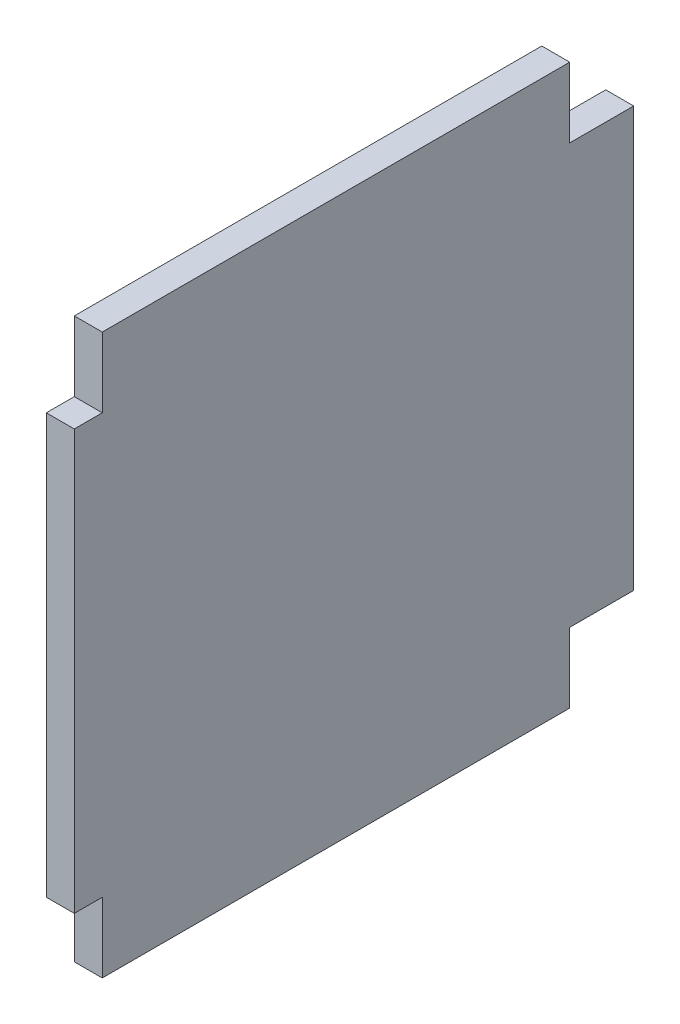
ISO-10303-21;
HEADER;
FILE_DESCRIPTION(('STEP AP214'),'2;1');
FILE_NAME('part.step','',(''),(''),'','','');
FILE_SCHEMA(('AUTOMOTIVE_DESIGN { 1 0 10303 214 1 1 1 1 }'));
ENDSEC;
DATA;
#1=APPLICATION_CONTEXT('core data for automotive mechanical design processes');
#2=APPLICATION_PROTOCOL_DEFINITION('international standard','automotive_design',2000,#1);
#3=PRODUCT_CONTEXT('',#1,'mechanical');
#4=PRODUCT('Part','Part','',(#3));
#5=PRODUCT_RELATED_PRODUCT_CATEGORY('part','',(#4));
#6=PRODUCT_DEFINITION_FORMATION('','',#4);
#7=PRODUCT_DEFINITION_CONTEXT('part definition',#1,'design');
#8=PRODUCT_DEFINITION('design','',#6,#7);
#9=PRODUCT_DEFINITION_SHAPE('','',#8);
#10=(LENGTH_UNIT() NAMED_UNIT(*) SI_UNIT(.MILLI.,.METRE.));
#11=(NAMED_UNIT(*) PLANE_ANGLE_UNIT() SI_UNIT($,.RADIAN.));
#12=(NAMED_UNIT(*) SI_UNIT($,.STERADIAN.) SOLID_ANGLE_UNIT());
#13=UNCERTAINTY_MEASURE_WITH_UNIT(LENGTH_MEASURE(1.E-05),#10,'distance_accuracy_value','');
#14=(GEOMETRIC_REPRESENTATION_CONTEXT(3) GLOBAL_UNCERTAINTY_ASSIGNED_CONTEXT((#13)) GLOBAL_UNIT_ASSIGNED_CONTEXT((#10,
#11,#12)) REPRESENTATION_CONTEXT('',''));
#15=CARTESIAN_POINT('',(0.,0.,0.));
#16=DIRECTION('',(0.,0.,1.));
#17=DIRECTION('',(1.,0.,0.));
#18=AXIS2_PLACEMENT_3D('',#15,#16,#17);
#19=CARTESIAN_POINT('',(214.,15.,65.4944730967406));
#20=DIRECTION('',(0.,-1.,0.));
#21=DIRECTION('',(0.,0.,-1.));
#22=AXIS2_PLACEMENT_3D('',#19,#20,#21);
#23=PLANE('',#22);
#24=DIRECTION('',(0.,0.,-1.));
#25=VECTOR('',#24,1.);
#26=CARTESIAN_POINT('',(216.,15.,65.4944730967406));
#27=LINE('',#26,#25);
#28=CARTESIAN_POINT('',(216.,15.,35.4278803399948));
#29=VERTEX_POINT('',#28);
#30=CARTESIAN_POINT('',(216.,15.,33.4278803399949));
#31=VERTEX_POINT('',#30);
#32=EDGE_CURVE('E174',#29,#31,#27,.T.);
#33=ORIENTED_EDGE('',*,*,#32,.T.);
#34=DIRECTION('',(-1.,0.,0.));
#35=VECTOR('',#34,1.);
#36=CARTESIAN_POINT('',(216.,15.,33.4278803399949));
#37=LINE('',#36,#35);
#38=CARTESIAN_POINT('',(214.,15.,33.4278803399949));
#39=VERTEX_POINT('',#38);
#40=EDGE_CURVE('E142',#31,#39,#37,.T.);
#41=ORIENTED_EDGE('',*,*,#40,.T.);
#42=DIRECTION('',(0.,0.,-1.));
#43=VECTOR('',#42,1.);
#44=CARTESIAN_POINT('',(214.,15.,65.4944730967406));
#45=LINE('',#44,#43);
#46=CARTESIAN_POINT('',(214.,15.,35.4278803399948));
#47=VERTEX_POINT('',#46);
#48=EDGE_CURVE('E201',#47,#39,#45,.T.);
#49=ORIENTED_EDGE('',*,*,#48,.F.);
#50=DIRECTION('',(-1.,0.,0.));
#51=VECTOR('',#50,1.);
#52=CARTESIAN_POINT('',(214.,15.,35.4278803399948));
#53=LINE('',#52,#51);
#54=EDGE_CURVE('E181',#29,#47,#53,.T.);
#55=ORIENTED_EDGE('',*,*,#54,.F.);
#56=EDGE_LOOP('',(#33,#41,#49,#55));
#57=FACE_BOUND('',#56,.T.);
#58=ADVANCED_FACE('F33',(#57),#23,.F.);
#59=CARTESIAN_POINT('',(214.,-15.,65.4944730967406));
#60=DIRECTION('',(0.,1.,0.));
#61=DIRECTION('',(0.,0.,1.));
#62=AXIS2_PLACEMENT_3D('',#59,#60,#61);
#63=PLANE('',#62);
#64=DIRECTION('',(1.,0.,0.));
#65=VECTOR('',#64,1.);
#66=CARTESIAN_POINT('',(216.,-15.,0.));
#67=LINE('',#66,#65);
#68=CARTESIAN_POINT('',(214.,-15.,0.));
#69=VERTEX_POINT('',#68);
#70=CARTESIAN_POINT('',(216.,-15.,0.));
#71=VERTEX_POINT('',#70);
#72=EDGE_CURVE('E230',#69,#71,#67,.T.);
#73=ORIENTED_EDGE('',*,*,#72,.F.);
#74=DIRECTION('',(0.,0.,-1.));
#75=VECTOR('',#74,1.);
#76=CARTESIAN_POINT('',(214.,-15.,65.4944730967406));
#77=LINE('',#76,#75);
#78=CARTESIAN_POINT('',(214.,-15.,-4.57211966000516));
#79=VERTEX_POINT('',#78);
#80=EDGE_CURVE('E202',#69,#79,#77,.T.);
#81=ORIENTED_EDGE('',*,*,#80,.T.);
#82=DIRECTION('',(-1.,0.,0.));
#83=VECTOR('',#82,1.);
#84=CARTESIAN_POINT('',(214.,-15.,-4.57211966000516));
#85=LINE('',#84,#83);
#86=CARTESIAN_POINT('',(216.,-15.,-4.57211966000516));
#87=VERTEX_POINT('',#86);
#88=EDGE_CURVE('E205',#87,#79,#85,.T.);
#89=ORIENTED_EDGE('',*,*,#88,.F.);
#90=DIRECTION('',(0.,0.,-1.));
#91=VECTOR('',#90,1.);
#92=CARTESIAN_POINT('',(216.,-15.,65.4944730967406));
#93=LINE('',#92,#91);
#94=EDGE_CURVE('E58',#71,#87,#93,.T.);
#95=ORIENTED_EDGE('',*,*,#94,.F.);
#96=EDGE_LOOP('',(#73,#81,#89,#95));
#97=FACE_BOUND('',#96,.T.);
#98=ADVANCED_FACE('F274',(#97),#63,.F.);
#99=DIRECTION('',(-1.,0.,0.));
#100=VECTOR('',#99,1.);
#101=CARTESIAN_POINT('',(216.,-15.,33.4278803399949));
#102=LINE('',#101,#100);
#103=CARTESIAN_POINT('',(216.,-15.,33.4278803399949));
#104=VERTEX_POINT('',#103);
#105=CARTESIAN_POINT('',(214.,-15.,33.4278803399949));
#106=VERTEX_POINT('',#105);
#107=EDGE_CURVE('E131',#104,#106,#102,.T.);
#108=ORIENTED_EDGE('',*,*,#107,.F.);
#109=CARTESIAN_POINT('',(216.,-15.,35.4278803399948));
#110=VERTEX_POINT('',#109);
#111=EDGE_CURVE('E185',#110,#104,#93,.T.);
#112=ORIENTED_EDGE('',*,*,#111,.F.);
#113=DIRECTION('',(1.,0.,0.));
#114=VECTOR('',#113,1.);
#115=CARTESIAN_POINT('',(214.,-15.,35.4278803399948));
#116=LINE('',#115,#114);
#117=CARTESIAN_POINT('',(214.,-15.,35.4278803399948));
#118=VERTEX_POINT('',#117);
#119=EDGE_CURVE('E42',#118,#110,#116,.T.);
#120=ORIENTED_EDGE('',*,*,#119,.F.);
#121=EDGE_CURVE('E198',#118,#106,#77,.T.);
#122=ORIENTED_EDGE('',*,*,#121,.T.);
#123=EDGE_LOOP('',(#108,#112,#120,#122));
#124=FACE_BOUND('',#123,.T.);
#125=ADVANCED_FACE('F283',(#124),#63,.F.);
#126=CARTESIAN_POINT('',(214.,15.,65.4944730967406));
#127=DIRECTION('',(1.,0.,0.));
#128=DIRECTION('',(0.,0.,-1.));
#129=AXIS2_PLACEMENT_3D('',#126,#127,#128);
#130=PLANE('',#129);
#131=DIRECTION('',(0.,-1.,0.));
#132=VECTOR('',#131,1.);
#133=CARTESIAN_POINT('',(214.,15.,35.4278803399948));
#134=LINE('',#133,#132);
#135=EDGE_CURVE('E183',#47,#118,#134,.T.);
#136=ORIENTED_EDGE('',*,*,#135,.F.);
#137=ORIENTED_EDGE('',*,*,#48,.T.);
#138=DIRECTION('',(0.,-1.,0.));
#139=VECTOR('',#138,1.);
#140=CARTESIAN_POINT('',(214.,20.,33.4278803399949));
#141=LINE('',#140,#139);
#142=CARTESIAN_POINT('',(214.,20.,33.4278803399949));
#143=VERTEX_POINT('',#142);
#144=EDGE_CURVE('E165',#143,#39,#141,.T.);
#145=ORIENTED_EDGE('',*,*,#144,.F.);
#146=DIRECTION('',(0.,0.,-1.));
#147=VECTOR('',#146,1.);
#148=CARTESIAN_POINT('',(214.,20.,0.));
#149=LINE('',#148,#147);
#150=CARTESIAN_POINT('',(214.,20.,0.));
#151=VERTEX_POINT('',#150);
#152=EDGE_CURVE('E145',#143,#151,#149,.T.);
#153=ORIENTED_EDGE('',*,*,#152,.T.);
#154=DIRECTION('',(0.,-1.,0.));
#155=VECTOR('',#154,1.);
#156=CARTESIAN_POINT('',(214.,20.,0.));
#157=LINE('',#156,#155);
#158=CARTESIAN_POINT('',(214.,15.,0.));
#159=VERTEX_POINT('',#158);
#160=EDGE_CURVE('E132',#151,#159,#157,.T.);
#161=ORIENTED_EDGE('',*,*,#160,.T.);
#162=CARTESIAN_POINT('',(214.,15.,-4.57211966000516));
#163=VERTEX_POINT('',#162);
#164=EDGE_CURVE('E158',#159,#163,#45,.T.);
#165=ORIENTED_EDGE('',*,*,#164,.T.);
#166=DIRECTION('',(0.,1.,0.));
#167=VECTOR('',#166,1.);
#168=CARTESIAN_POINT('',(214.,15.,-4.57211966000516));
#169=LINE('',#168,#167);
#170=EDGE_CURVE('E210',#79,#163,#169,.T.);
#171=ORIENTED_EDGE('',*,*,#170,.F.);
#172=ORIENTED_EDGE('',*,*,#80,.F.);
#173=DIRECTION('',(0.,1.,0.));
#174=VECTOR('',#173,1.);
#175=CARTESIAN_POINT('',(214.,-20.,0.));
#176=LINE('',#175,#174);
#177=CARTESIAN_POINT('',(214.,-20.,0.));
#178=VERTEX_POINT('',#177);
#179=EDGE_CURVE('E250',#178,#69,#176,.T.);
#180=ORIENTED_EDGE('',*,*,#179,.F.);
#181=DIRECTION('',(0.,0.,-1.));
#182=VECTOR('',#181,1.);
#183=CARTESIAN_POINT('',(214.,-20.,0.));
#184=LINE('',#183,#182);
#185=CARTESIAN_POINT('',(214.,-20.,33.4278803399949));
#186=VERTEX_POINT('',#185);
#187=EDGE_CURVE('E276',#186,#178,#184,.T.);
#188=ORIENTED_EDGE('',*,*,#187,.F.);
#189=DIRECTION('',(0.,1.,0.));
#190=VECTOR('',#189,1.);
#191=CARTESIAN_POINT('',(214.,-20.,33.4278803399949));
#192=LINE('',#191,#190);
#193=EDGE_CURVE('E231',#186,#106,#192,.T.);
#194=ORIENTED_EDGE('',*,*,#193,.T.);
#195=ORIENTED_EDGE('',*,*,#121,.F.);
#196=EDGE_LOOP('',(#136,#137,#145,#153,#161,#165,#171,#172,#180,#188,#194,#195));
#197=FACE_BOUND('',#196,.T.);
#198=ADVANCED_FACE('F275',(#197),#130,.F.);
#199=CARTESIAN_POINT('',(216.,15.,65.4944730967406));
#200=DIRECTION('',(-1.,0.,0.));
#201=DIRECTION('',(0.,0.,1.));
#202=AXIS2_PLACEMENT_3D('',#199,#200,#201);
#203=PLANE('',#202);
#204=DIRECTION('',(0.,1.,0.));
#205=VECTOR('',#204,1.);
#206=CARTESIAN_POINT('',(216.,15.,35.4278803399948));
#207=LINE('',#206,#205);
#208=EDGE_CURVE('E11',#110,#29,#207,.T.);
#209=ORIENTED_EDGE('',*,*,#208,.F.);
#210=ORIENTED_EDGE('',*,*,#111,.T.);
#211=DIRECTION('',(0.,1.,0.));
#212=VECTOR('',#211,1.);
#213=CARTESIAN_POINT('',(216.,-20.,33.4278803399949));
#214=LINE('',#213,#212);
#215=CARTESIAN_POINT('',(216.,-20.,33.4278803399949));
#216=VERTEX_POINT('',#215);
#217=EDGE_CURVE('E257',#216,#104,#214,.T.);
#218=ORIENTED_EDGE('',*,*,#217,.F.);
#219=DIRECTION('',(0.,0.,1.));
#220=VECTOR('',#219,1.);
#221=CARTESIAN_POINT('',(216.,-20.,0.));
#222=LINE('',#221,#220);
#223=CARTESIAN_POINT('',(216.,-20.,0.));
#224=VERTEX_POINT('',#223);
#225=EDGE_CURVE('E244',#224,#216,#222,.T.);
#226=ORIENTED_EDGE('',*,*,#225,.F.);
#227=DIRECTION('',(0.,1.,0.));
#228=VECTOR('',#227,1.);
#229=CARTESIAN_POINT('',(216.,-20.,0.));
#230=LINE('',#229,#228);
#231=EDGE_CURVE('E247',#224,#71,#230,.T.);
#232=ORIENTED_EDGE('',*,*,#231,.T.);
#233=ORIENTED_EDGE('',*,*,#94,.T.);
#234=DIRECTION('',(0.,-1.,0.));
#235=VECTOR('',#234,1.);
#236=CARTESIAN_POINT('',(216.,15.,-4.57211966000516));
#237=LINE('',#236,#235);
#238=CARTESIAN_POINT('',(216.,15.,-4.57211966000516));
#239=VERTEX_POINT('',#238);
#240=EDGE_CURVE('E240',#239,#87,#237,.T.);
#241=ORIENTED_EDGE('',*,*,#240,.F.);
#242=CARTESIAN_POINT('',(216.,15.,0.));
#243=VERTEX_POINT('',#242);
#244=EDGE_CURVE('E130',#243,#239,#27,.T.);
#245=ORIENTED_EDGE('',*,*,#244,.F.);
#246=DIRECTION('',(0.,-1.,0.));
#247=VECTOR('',#246,1.);
#248=CARTESIAN_POINT('',(216.,20.,0.));
#249=LINE('',#248,#247);
#250=CARTESIAN_POINT('',(216.,20.,0.));
#251=VERTEX_POINT('',#250);
#252=EDGE_CURVE('E50',#251,#243,#249,.T.);
#253=ORIENTED_EDGE('',*,*,#252,.F.);
#254=DIRECTION('',(0.,0.,1.));
#255=VECTOR('',#254,1.);
#256=CARTESIAN_POINT('',(216.,20.,0.));
#257=LINE('',#256,#255);
#258=CARTESIAN_POINT('',(216.,20.,33.4278803399949));
#259=VERTEX_POINT('',#258);
#260=EDGE_CURVE('E127',#251,#259,#257,.T.);
#261=ORIENTED_EDGE('',*,*,#260,.T.);
#262=DIRECTION('',(0.,-1.,0.));
#263=VECTOR('',#262,1.);
#264=CARTESIAN_POINT('',(216.,20.,33.4278803399949));
#265=LINE('',#264,#263);
#266=EDGE_CURVE('E150',#259,#31,#265,.T.);
#267=ORIENTED_EDGE('',*,*,#266,.T.);
#268=ORIENTED_EDGE('',*,*,#32,.F.);
#269=EDGE_LOOP('',(#209,#210,#218,#226,#232,#233,#241,#245,#253,#261,#267,#268));
#270=FACE_BOUND('',#269,.T.);
#271=ADVANCED_FACE('F126',(#270),#203,.F.);
#272=ORIENTED_EDGE('',*,*,#164,.F.);
#273=DIRECTION('',(1.,0.,0.));
#274=VECTOR('',#273,1.);
#275=CARTESIAN_POINT('',(216.,15.,0.));
#276=LINE('',#275,#274);
#277=EDGE_CURVE('E156',#159,#243,#276,.T.);
#278=ORIENTED_EDGE('',*,*,#277,.T.);
#279=ORIENTED_EDGE('',*,*,#244,.T.);
#280=DIRECTION('',(1.,0.,0.));
#281=VECTOR('',#280,1.);
#282=CARTESIAN_POINT('',(214.,15.,-4.57211966000516));
#283=LINE('',#282,#281);
#284=EDGE_CURVE('E214',#163,#239,#283,.T.);
#285=ORIENTED_EDGE('',*,*,#284,.F.);
#286=EDGE_LOOP('',(#272,#278,#279,#285));
#287=FACE_BOUND('',#286,.T.);
#288=ADVANCED_FACE('F296',(#287),#23,.F.);
#289=CARTESIAN_POINT('',(143.999999999999,3.84978507406153E-12,35.4278803399948));
#290=DIRECTION('',(0.,0.,1.));
#291=DIRECTION('',(-1.,0.,0.));
#292=AXIS2_PLACEMENT_3D('',#289,#290,#291);
#293=PLANE('',#292);
#294=ORIENTED_EDGE('',*,*,#54,.T.);
#295=ORIENTED_EDGE('',*,*,#135,.T.);
#296=ORIENTED_EDGE('',*,*,#119,.T.);
#297=ORIENTED_EDGE('',*,*,#208,.T.);
#298=EDGE_LOOP('',(#294,#295,#296,#297));
#299=FACE_BOUND('',#298,.T.);
#300=ADVANCED_FACE('F35',(#299),#293,.T.);
#301=CARTESIAN_POINT('',(-1.0547118733939E-12,3.85802501057242E-12,-4.57211966000516));
#302=DIRECTION('',(0.,0.,1.));
#303=DIRECTION('',(0.,-1.,0.));
#304=AXIS2_PLACEMENT_3D('',#301,#302,#303);
#305=PLANE('',#304);
#306=ORIENTED_EDGE('',*,*,#170,.T.);
#307=ORIENTED_EDGE('',*,*,#284,.T.);
#308=ORIENTED_EDGE('',*,*,#240,.T.);
#309=ORIENTED_EDGE('',*,*,#88,.T.);
#310=EDGE_LOOP('',(#306,#307,#308,#309));
#311=FACE_BOUND('',#310,.T.);
#312=ADVANCED_FACE('F267',(#311),#305,.F.);
#313=CARTESIAN_POINT('',(216.,-20.,33.4278803399949));
#314=DIRECTION('',(0.,0.,-1.));
#315=DIRECTION('',(-1.,0.,0.));
#316=AXIS2_PLACEMENT_3D('',#313,#314,#315);
#317=PLANE('',#316);
#318=ORIENTED_EDGE('',*,*,#107,.T.);
#319=ORIENTED_EDGE('',*,*,#193,.F.);
#320=DIRECTION('',(-1.,0.,0.));
#321=VECTOR('',#320,1.);
#322=CARTESIAN_POINT('',(216.,-20.,33.4278803399949));
#323=LINE('',#322,#321);
#324=EDGE_CURVE('E278',#216,#186,#323,.T.);
#325=ORIENTED_EDGE('',*,*,#324,.F.);
#326=ORIENTED_EDGE('',*,*,#217,.T.);
#327=EDGE_LOOP('',(#318,#319,#325,#326));
#328=FACE_BOUND('',#327,.T.);
#329=ADVANCED_FACE('F285',(#328),#317,.F.);
#330=CARTESIAN_POINT('',(216.,-20.,0.));
#331=DIRECTION('',(0.,0.,1.));
#332=DIRECTION('',(1.,0.,0.));
#333=AXIS2_PLACEMENT_3D('',#330,#331,#332);
#334=PLANE('',#333);
#335=ORIENTED_EDGE('',*,*,#72,.T.);
#336=ORIENTED_EDGE('',*,*,#231,.F.);
#337=DIRECTION('',(1.,0.,0.));
#338=VECTOR('',#337,1.);
#339=CARTESIAN_POINT('',(216.,-20.,0.));
#340=LINE('',#339,#338);
#341=EDGE_CURVE('E236',#178,#224,#340,.T.);
#342=ORIENTED_EDGE('',*,*,#341,.F.);
#343=ORIENTED_EDGE('',*,*,#179,.T.);
#344=EDGE_LOOP('',(#335,#336,#342,#343));
#345=FACE_BOUND('',#344,.T.);
#346=ADVANCED_FACE('F272',(#345),#334,.F.);
#347=CARTESIAN_POINT('',(0.,-20.,0.));
#348=DIRECTION('',(0.,-1.,0.));
#349=DIRECTION('',(0.,0.,-1.));
#350=AXIS2_PLACEMENT_3D('',#347,#348,#349);
#351=PLANE('',#350);
#352=ORIENTED_EDGE('',*,*,#225,.T.);
#353=ORIENTED_EDGE('',*,*,#324,.T.);
#354=ORIENTED_EDGE('',*,*,#187,.T.);
#355=ORIENTED_EDGE('',*,*,#341,.T.);
#356=EDGE_LOOP('',(#352,#353,#354,#355));
#357=FACE_BOUND('',#356,.T.);
#358=ADVANCED_FACE('F280',(#357),#351,.T.);
#359=CARTESIAN_POINT('',(216.,20.,0.));
#360=DIRECTION('',(0.,0.,-1.));
#361=DIRECTION('',(-1.,0.,0.));
#362=AXIS2_PLACEMENT_3D('',#359,#360,#361);
#363=PLANE('',#362);
#364=ORIENTED_EDGE('',*,*,#277,.F.);
#365=ORIENTED_EDGE('',*,*,#160,.F.);
#366=DIRECTION('',(1.,0.,0.));
#367=VECTOR('',#366,1.);
#368=CARTESIAN_POINT('',(216.,20.,0.));
#369=LINE('',#368,#367);
#370=EDGE_CURVE('E138',#151,#251,#369,.T.);
#371=ORIENTED_EDGE('',*,*,#370,.T.);
#372=ORIENTED_EDGE('',*,*,#252,.T.);
#373=EDGE_LOOP('',(#364,#365,#371,#372));
#374=FACE_BOUND('',#373,.T.);
#375=ADVANCED_FACE('F144',(#374),#363,.T.);
#376=CARTESIAN_POINT('',(216.,20.,33.4278803399949));
#377=DIRECTION('',(0.,0.,1.));
#378=DIRECTION('',(1.,0.,0.));
#379=AXIS2_PLACEMENT_3D('',#376,#377,#378);
#380=PLANE('',#379);
#381=ORIENTED_EDGE('',*,*,#40,.F.);
#382=ORIENTED_EDGE('',*,*,#266,.F.);
#383=DIRECTION('',(-1.,0.,0.));
#384=VECTOR('',#383,1.);
#385=CARTESIAN_POINT('',(216.,20.,33.4278803399949));
#386=LINE('',#385,#384);
#387=EDGE_CURVE('E141',#259,#143,#386,.T.);
#388=ORIENTED_EDGE('',*,*,#387,.T.);
#389=ORIENTED_EDGE('',*,*,#144,.T.);
#390=EDGE_LOOP('',(#381,#382,#388,#389));
#391=FACE_BOUND('',#390,.T.);
#392=ADVANCED_FACE('F177',(#391),#380,.T.);
#393=CARTESIAN_POINT('',(0.,20.,0.));
#394=DIRECTION('',(0.,1.,0.));
#395=DIRECTION('',(0.,0.,-1.));
#396=AXIS2_PLACEMENT_3D('',#393,#394,#395);
#397=PLANE('',#396);
#398=ORIENTED_EDGE('',*,*,#260,.F.);
#399=ORIENTED_EDGE('',*,*,#370,.F.);
#400=ORIENTED_EDGE('',*,*,#152,.F.);
#401=ORIENTED_EDGE('',*,*,#387,.F.);
#402=EDGE_LOOP('',(#398,#399,#400,#401));
#403=FACE_BOUND('',#402,.T.);
#404=ADVANCED_FACE('F136',(#403),#397,.T.);
#405=CLOSED_SHELL('',(#58,#98,#125,#198,#271,#288,#300,#312,#329,#346,#358,#375,#392,#404));
#406=MANIFOLD_SOLID_BREP('B2',#405);
#407=ADVANCED_BREP_SHAPE_REPRESENTATION('',(#18,#406),#14);
#408=SHAPE_DEFINITION_REPRESENTATION(#9,#407);
ENDSEC;
END-ISO-10303-21;
